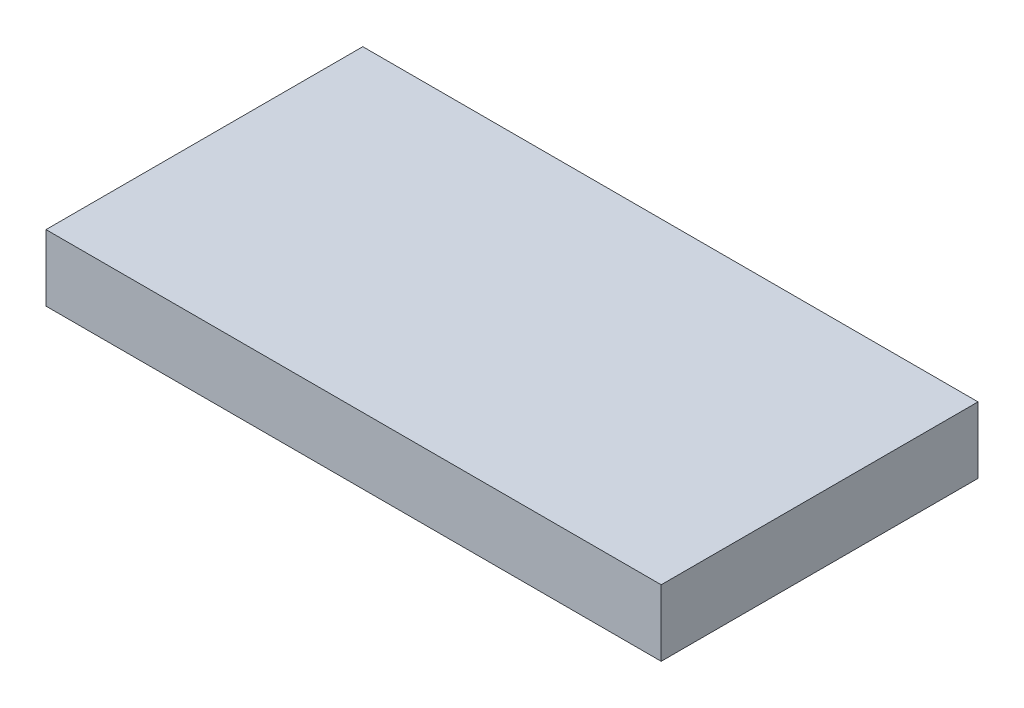
ISO-10303-21;
HEADER;
FILE_DESCRIPTION(('STEP AP214'),'2;1');
FILE_NAME('part.step','',(''),(''),'','','');
FILE_SCHEMA(('AUTOMOTIVE_DESIGN { 1 0 10303 214 1 1 1 1 }'));
ENDSEC;
DATA;
#1=APPLICATION_CONTEXT('core data for automotive mechanical design processes');
#2=APPLICATION_PROTOCOL_DEFINITION('international standard','automotive_design',2000,#1);
#3=PRODUCT_CONTEXT('',#1,'mechanical');
#4=PRODUCT('Part','Part','',(#3));
#5=PRODUCT_RELATED_PRODUCT_CATEGORY('part','',(#4));
#6=PRODUCT_DEFINITION_FORMATION('','',#4);
#7=PRODUCT_DEFINITION_CONTEXT('part definition',#1,'design');
#8=PRODUCT_DEFINITION('design','',#6,#7);
#9=PRODUCT_DEFINITION_SHAPE('','',#8);
#10=(LENGTH_UNIT() NAMED_UNIT(*) SI_UNIT(.MILLI.,.METRE.));
#11=(NAMED_UNIT(*) PLANE_ANGLE_UNIT() SI_UNIT($,.RADIAN.));
#12=(NAMED_UNIT(*) SI_UNIT($,.STERADIAN.) SOLID_ANGLE_UNIT());
#13=UNCERTAINTY_MEASURE_WITH_UNIT(LENGTH_MEASURE(1.E-05),#10,'distance_accuracy_value','');
#14=(GEOMETRIC_REPRESENTATION_CONTEXT(3) GLOBAL_UNCERTAINTY_ASSIGNED_CONTEXT((#13)) GLOBAL_UNIT_ASSIGNED_CONTEXT((#10,
#11,#12)) REPRESENTATION_CONTEXT('',''));
#15=CARTESIAN_POINT('',(0.,0.,0.));
#16=DIRECTION('',(0.,0.,1.));
#17=DIRECTION('',(1.,0.,0.));
#18=AXIS2_PLACEMENT_3D('',#15,#16,#17);
#19=CARTESIAN_POINT('',(0.,18.,0.));
#20=DIRECTION('',(1.,0.,0.));
#21=DIRECTION('',(0.,0.,-1.));
#22=AXIS2_PLACEMENT_3D('',#19,#20,#21);
#23=PLANE('',#22);
#24=DIRECTION('',(0.,0.,1.));
#25=VECTOR('',#24,1.);
#26=CARTESIAN_POINT('',(0.,0.,0.));
#27=LINE('',#26,#25);
#28=CARTESIAN_POINT('',(0.,0.,-86.));
#29=VERTEX_POINT('',#28);
#30=CARTESIAN_POINT('',(0.,0.,0.));
#31=VERTEX_POINT('',#30);
#32=EDGE_CURVE('E96',#29,#31,#27,.T.);
#33=ORIENTED_EDGE('',*,*,#32,.T.);
#34=DIRECTION('',(0.,-1.,0.));
#35=VECTOR('',#34,1.);
#36=CARTESIAN_POINT('',(0.,18.,0.));
#37=LINE('',#36,#35);
#38=CARTESIAN_POINT('',(0.,18.,0.));
#39=VERTEX_POINT('',#38);
#40=EDGE_CURVE('E11',#39,#31,#37,.T.);
#41=ORIENTED_EDGE('',*,*,#40,.F.);
#42=DIRECTION('',(0.,0.,1.));
#43=VECTOR('',#42,1.);
#44=CARTESIAN_POINT('',(0.,18.,0.));
#45=LINE('',#44,#43);
#46=CARTESIAN_POINT('',(0.,18.,-86.));
#47=VERTEX_POINT('',#46);
#48=EDGE_CURVE('E84',#47,#39,#45,.T.);
#49=ORIENTED_EDGE('',*,*,#48,.F.);
#50=DIRECTION('',(0.,-1.,0.));
#51=VECTOR('',#50,1.);
#52=CARTESIAN_POINT('',(0.,18.,-86.));
#53=LINE('',#52,#51);
#54=EDGE_CURVE('E92',#47,#29,#53,.T.);
#55=ORIENTED_EDGE('',*,*,#54,.T.);
#56=EDGE_LOOP('',(#33,#41,#49,#55));
#57=FACE_BOUND('',#56,.T.);
#58=ADVANCED_FACE('F33',(#57),#23,.F.);
#59=CARTESIAN_POINT('',(0.,18.,0.));
#60=DIRECTION('',(0.,0.,-1.));
#61=DIRECTION('',(-1.,0.,0.));
#62=AXIS2_PLACEMENT_3D('',#59,#60,#61);
#63=PLANE('',#62);
#64=DIRECTION('',(1.,0.,0.));
#65=VECTOR('',#64,1.);
#66=CARTESIAN_POINT('',(0.,0.,0.));
#67=LINE('',#66,#65);
#68=CARTESIAN_POINT('',(167.,0.,0.));
#69=VERTEX_POINT('',#68);
#70=EDGE_CURVE('E88',#31,#69,#67,.T.);
#71=ORIENTED_EDGE('',*,*,#70,.T.);
#72=DIRECTION('',(0.,-1.,0.));
#73=VECTOR('',#72,1.);
#74=CARTESIAN_POINT('',(167.,18.,0.));
#75=LINE('',#74,#73);
#76=CARTESIAN_POINT('',(167.,18.,0.));
#77=VERTEX_POINT('',#76);
#78=EDGE_CURVE('E41',#77,#69,#75,.T.);
#79=ORIENTED_EDGE('',*,*,#78,.F.);
#80=DIRECTION('',(1.,0.,0.));
#81=VECTOR('',#80,1.);
#82=CARTESIAN_POINT('',(0.,18.,0.));
#83=LINE('',#82,#81);
#84=EDGE_CURVE('E79',#39,#77,#83,.T.);
#85=ORIENTED_EDGE('',*,*,#84,.F.);
#86=ORIENTED_EDGE('',*,*,#40,.T.);
#87=EDGE_LOOP('',(#71,#79,#85,#86));
#88=FACE_BOUND('',#87,.T.);
#89=ADVANCED_FACE('F87',(#88),#63,.F.);
#90=CARTESIAN_POINT('',(167.,18.,0.));
#91=DIRECTION('',(-1.,0.,0.));
#92=DIRECTION('',(0.,0.,1.));
#93=AXIS2_PLACEMENT_3D('',#90,#91,#92);
#94=PLANE('',#93);
#95=DIRECTION('',(0.,0.,-1.));
#96=VECTOR('',#95,1.);
#97=CARTESIAN_POINT('',(167.,0.,0.));
#98=LINE('',#97,#96);
#99=CARTESIAN_POINT('',(167.,0.,-86.));
#100=VERTEX_POINT('',#99);
#101=EDGE_CURVE('E66',#69,#100,#98,.T.);
#102=ORIENTED_EDGE('',*,*,#101,.T.);
#103=DIRECTION('',(0.,-1.,0.));
#104=VECTOR('',#103,1.);
#105=CARTESIAN_POINT('',(167.,18.,-86.));
#106=LINE('',#105,#104);
#107=CARTESIAN_POINT('',(167.,18.,-86.));
#108=VERTEX_POINT('',#107);
#109=EDGE_CURVE('E89',#108,#100,#106,.T.);
#110=ORIENTED_EDGE('',*,*,#109,.F.);
#111=DIRECTION('',(0.,0.,-1.));
#112=VECTOR('',#111,1.);
#113=CARTESIAN_POINT('',(167.,18.,0.));
#114=LINE('',#113,#112);
#115=EDGE_CURVE('E82',#77,#108,#114,.T.);
#116=ORIENTED_EDGE('',*,*,#115,.F.);
#117=ORIENTED_EDGE('',*,*,#78,.T.);
#118=EDGE_LOOP('',(#102,#110,#116,#117));
#119=FACE_BOUND('',#118,.T.);
#120=ADVANCED_FACE('F90',(#119),#94,.F.);
#121=CARTESIAN_POINT('',(0.,18.,-86.));
#122=DIRECTION('',(0.,0.,1.));
#123=DIRECTION('',(1.,0.,0.));
#124=AXIS2_PLACEMENT_3D('',#121,#122,#123);
#125=PLANE('',#124);
#126=DIRECTION('',(-1.,0.,0.));
#127=VECTOR('',#126,1.);
#128=CARTESIAN_POINT('',(0.,0.,-86.));
#129=LINE('',#128,#127);
#130=EDGE_CURVE('E72',#100,#29,#129,.T.);
#131=ORIENTED_EDGE('',*,*,#130,.T.);
#132=ORIENTED_EDGE('',*,*,#54,.F.);
#133=DIRECTION('',(-1.,0.,0.));
#134=VECTOR('',#133,1.);
#135=CARTESIAN_POINT('',(0.,18.,-86.));
#136=LINE('',#135,#134);
#137=EDGE_CURVE('E49',#108,#47,#136,.T.);
#138=ORIENTED_EDGE('',*,*,#137,.F.);
#139=ORIENTED_EDGE('',*,*,#109,.T.);
#140=EDGE_LOOP('',(#131,#132,#138,#139));
#141=FACE_BOUND('',#140,.T.);
#142=ADVANCED_FACE('F103',(#141),#125,.F.);
#143=CARTESIAN_POINT('',(0.,18.,0.));
#144=DIRECTION('',(0.,-1.,0.));
#145=DIRECTION('',(0.,0.,-1.));
#146=AXIS2_PLACEMENT_3D('',#143,#144,#145);
#147=PLANE('',#146);
#148=ORIENTED_EDGE('',*,*,#48,.T.);
#149=ORIENTED_EDGE('',*,*,#84,.T.);
#150=ORIENTED_EDGE('',*,*,#115,.T.);
#151=ORIENTED_EDGE('',*,*,#137,.T.);
#152=EDGE_LOOP('',(#148,#149,#150,#151));
#153=FACE_BOUND('',#152,.T.);
#154=ADVANCED_FACE('F80',(#153),#147,.F.);
#155=CARTESIAN_POINT('',(0.,0.,0.));
#156=DIRECTION('',(0.,-1.,0.));
#157=DIRECTION('',(0.,0.,-1.));
#158=AXIS2_PLACEMENT_3D('',#155,#156,#157);
#159=PLANE('',#158);
#160=ORIENTED_EDGE('',*,*,#32,.F.);
#161=ORIENTED_EDGE('',*,*,#130,.F.);
#162=ORIENTED_EDGE('',*,*,#101,.F.);
#163=ORIENTED_EDGE('',*,*,#70,.F.);
#164=EDGE_LOOP('',(#160,#161,#162,#163));
#165=FACE_BOUND('',#164,.T.);
#166=ADVANCED_FACE('F106',(#165),#159,.T.);
#167=CLOSED_SHELL('',(#58,#89,#120,#142,#154,#166));
#168=MANIFOLD_SOLID_BREP('B2',#167);
#169=ADVANCED_BREP_SHAPE_REPRESENTATION('',(#18,#168),#14);
#170=SHAPE_DEFINITION_REPRESENTATION(#9,#169);
ENDSEC;
END-ISO-10303-21;
